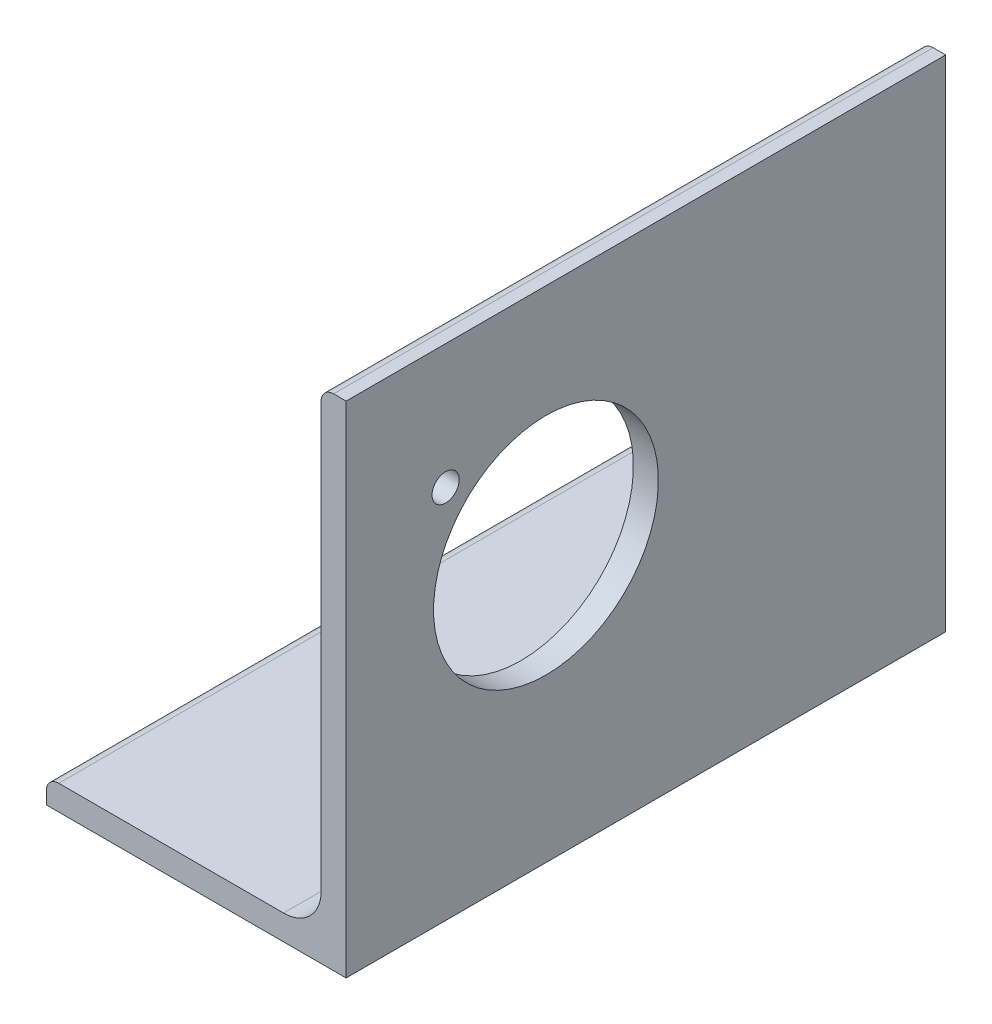
ISO-10303-21;
HEADER;
FILE_DESCRIPTION(('STEP AP214'),'2;1');
FILE_NAME('part.step','',(''),(''),'','','');
FILE_SCHEMA(('AUTOMOTIVE_DESIGN { 1 0 10303 214 1 1 1 1 }'));
ENDSEC;
DATA;
#1=APPLICATION_CONTEXT('core data for automotive mechanical design processes');
#2=APPLICATION_PROTOCOL_DEFINITION('international standard','automotive_design',2000,#1);
#3=PRODUCT_CONTEXT('',#1,'mechanical');
#4=PRODUCT('Part','Part','',(#3));
#5=PRODUCT_RELATED_PRODUCT_CATEGORY('part','',(#4));
#6=PRODUCT_DEFINITION_FORMATION('','',#4);
#7=PRODUCT_DEFINITION_CONTEXT('part definition',#1,'design');
#8=PRODUCT_DEFINITION('design','',#6,#7);
#9=PRODUCT_DEFINITION_SHAPE('','',#8);
#10=(LENGTH_UNIT() NAMED_UNIT(*) SI_UNIT(.MILLI.,.METRE.));
#11=(NAMED_UNIT(*) PLANE_ANGLE_UNIT() SI_UNIT($,.RADIAN.));
#12=(NAMED_UNIT(*) SI_UNIT($,.STERADIAN.) SOLID_ANGLE_UNIT());
#13=UNCERTAINTY_MEASURE_WITH_UNIT(LENGTH_MEASURE(1.E-05),#10,'distance_accuracy_value','');
#14=(GEOMETRIC_REPRESENTATION_CONTEXT(3) GLOBAL_UNCERTAINTY_ASSIGNED_CONTEXT((#13)) GLOBAL_UNIT_ASSIGNED_CONTEXT((#10,
#11,#12)) REPRESENTATION_CONTEXT('',''));
#15=CARTESIAN_POINT('',(0.,0.,0.));
#16=DIRECTION('',(0.,0.,1.));
#17=DIRECTION('',(1.,0.,0.));
#18=AXIS2_PLACEMENT_3D('',#15,#16,#17);
#19=CARTESIAN_POINT('',(-19.05,-30.1625,38.1));
#20=DIRECTION('',(1.,0.,0.));
#21=DIRECTION('',(0.,0.,-1.));
#22=AXIS2_PLACEMENT_3D('',#19,#20,#21);
#23=PLANE('',#22);
#24=DIRECTION('',(0.,-1.,0.));
#25=VECTOR('',#24,1.);
#26=CARTESIAN_POINT('',(-19.05,-30.1625,-38.1));
#27=LINE('',#26,#25);
#28=CARTESIAN_POINT('',(-19.05,-30.1625,-38.1));
#29=VERTEX_POINT('',#28);
#30=CARTESIAN_POINT('',(-19.05,-31.75,-38.1));
#31=VERTEX_POINT('',#30);
#32=EDGE_CURVE('E153',#29,#31,#27,.T.);
#33=ORIENTED_EDGE('',*,*,#32,.T.);
#34=DIRECTION('',(0.,0.,-1.));
#35=VECTOR('',#34,1.);
#36=CARTESIAN_POINT('',(-19.05,-31.75,38.1));
#37=LINE('',#36,#35);
#38=CARTESIAN_POINT('',(-19.05,-31.75,38.1));
#39=VERTEX_POINT('',#38);
#40=EDGE_CURVE('E11',#39,#31,#37,.T.);
#41=ORIENTED_EDGE('',*,*,#40,.F.);
#42=DIRECTION('',(0.,-1.,0.));
#43=VECTOR('',#42,1.);
#44=CARTESIAN_POINT('',(-19.05,-30.1625,38.1));
#45=LINE('',#44,#43);
#46=CARTESIAN_POINT('',(-19.05,-30.1625,38.1));
#47=VERTEX_POINT('',#46);
#48=EDGE_CURVE('E179',#47,#39,#45,.T.);
#49=ORIENTED_EDGE('',*,*,#48,.F.);
#50=DIRECTION('',(0.,0.,-1.));
#51=VECTOR('',#50,1.);
#52=CARTESIAN_POINT('',(-19.05,-30.1625,38.1));
#53=LINE('',#52,#51);
#54=EDGE_CURVE('E149',#47,#29,#53,.T.);
#55=ORIENTED_EDGE('',*,*,#54,.T.);
#56=EDGE_LOOP('',(#33,#41,#49,#55));
#57=FACE_BOUND('',#56,.T.);
#58=ADVANCED_FACE('F44',(#57),#23,.F.);
#59=CARTESIAN_POINT('',(-19.05,-31.75,38.1));
#60=DIRECTION('',(0.,1.,0.));
#61=DIRECTION('',(-1.,0.,0.));
#62=AXIS2_PLACEMENT_3D('',#59,#60,#61);
#63=PLANE('',#62);
#64=CARTESIAN_POINT('',(0.,-31.75,0.));
#65=DIRECTION('',(0.,-1.,0.));
#66=DIRECTION('',(1.,0.,0.));
#67=AXIS2_PLACEMENT_3D('',#64,#65,#66);
#68=CIRCLE('',#67,2.4892);
#69=CARTESIAN_POINT('',(2.4892,-31.75,0.));
#70=VERTEX_POINT('',#69);
#71=EDGE_CURVE('E203',#70,#70,#68,.T.);
#72=ORIENTED_EDGE('',*,*,#71,.F.);
#73=EDGE_LOOP('',(#72));
#74=FACE_BOUND('',#73,.T.);
#75=CARTESIAN_POINT('',(0.,-31.75,-25.4));
#76=DIRECTION('',(0.,-1.,0.));
#77=DIRECTION('',(1.,0.,0.));
#78=AXIS2_PLACEMENT_3D('',#75,#76,#77);
#79=CIRCLE('',#78,2.4892);
#80=CARTESIAN_POINT('',(2.4892,-31.75,-25.4));
#81=VERTEX_POINT('',#80);
#82=EDGE_CURVE('E211',#81,#81,#79,.T.);
#83=ORIENTED_EDGE('',*,*,#82,.F.);
#84=EDGE_LOOP('',(#83));
#85=FACE_BOUND('',#84,.T.);
#86=DIRECTION('',(1.,0.,0.));
#87=VECTOR('',#86,1.);
#88=CARTESIAN_POINT('',(-19.05,-31.75,-38.1));
#89=LINE('',#88,#87);
#90=CARTESIAN_POINT('',(19.05,-31.75,-38.1));
#91=VERTEX_POINT('',#90);
#92=EDGE_CURVE('E157',#31,#91,#89,.T.);
#93=ORIENTED_EDGE('',*,*,#92,.T.);
#94=DIRECTION('',(0.,0.,-1.));
#95=VECTOR('',#94,1.);
#96=CARTESIAN_POINT('',(19.05,-31.75,38.1));
#97=LINE('',#96,#95);
#98=CARTESIAN_POINT('',(19.05,-31.75,38.1));
#99=VERTEX_POINT('',#98);
#100=EDGE_CURVE('E54',#99,#91,#97,.T.);
#101=ORIENTED_EDGE('',*,*,#100,.F.);
#102=DIRECTION('',(1.,0.,0.));
#103=VECTOR('',#102,1.);
#104=CARTESIAN_POINT('',(-19.05,-31.75,38.1));
#105=LINE('',#104,#103);
#106=EDGE_CURVE('E109',#39,#99,#105,.T.);
#107=ORIENTED_EDGE('',*,*,#106,.F.);
#108=ORIENTED_EDGE('',*,*,#40,.T.);
#109=EDGE_LOOP('',(#93,#101,#107,#108));
#110=FACE_BOUND('',#109,.T.);
#111=ADVANCED_FACE('F275',(#74,#85,#110),#63,.F.);
#112=CARTESIAN_POINT('',(19.05,-31.75,38.1));
#113=DIRECTION('',(-1.,0.,0.));
#114=DIRECTION('',(0.,-1.,0.));
#115=AXIS2_PLACEMENT_3D('',#112,#113,#114);
#116=PLANE('',#115);
#117=CARTESIAN_POINT('',(19.05,15.9317261919403,25.4519637415276));
#118=DIRECTION('',(-1.,0.,0.));
#119=DIRECTION('',(0.,-1.,0.));
#120=AXIS2_PLACEMENT_3D('',#117,#118,#119);
#121=CIRCLE('',#120,1.7272);
#122=CARTESIAN_POINT('',(19.05,14.2045261919403,25.4519637415276));
#123=VERTEX_POINT('',#122);
#124=EDGE_CURVE('E209',#123,#123,#121,.T.);
#125=ORIENTED_EDGE('',*,*,#124,.T.);
#126=EDGE_LOOP('',(#125));
#127=FACE_BOUND('',#126,.T.);
#128=CARTESIAN_POINT('',(19.05,3.17976250002207,12.7000000496094));
#129=DIRECTION('',(-1.,0.,0.));
#130=DIRECTION('',(0.,-1.,0.));
#131=AXIS2_PLACEMENT_3D('',#128,#129,#130);
#132=CIRCLE('',#131,14.2875);
#133=CARTESIAN_POINT('',(19.05,-11.1077374999779,12.7000000496094));
#134=VERTEX_POINT('',#133);
#135=EDGE_CURVE('E158',#134,#134,#132,.T.);
#136=ORIENTED_EDGE('',*,*,#135,.T.);
#137=EDGE_LOOP('',(#136));
#138=FACE_BOUND('',#137,.T.);
#139=DIRECTION('',(0.,1.,0.));
#140=VECTOR('',#139,1.);
#141=CARTESIAN_POINT('',(19.05,-31.75,-38.1));
#142=LINE('',#141,#140);
#143=CARTESIAN_POINT('',(19.05,31.75,-38.1));
#144=VERTEX_POINT('',#143);
#145=EDGE_CURVE('E161',#91,#144,#142,.T.);
#146=ORIENTED_EDGE('',*,*,#145,.T.);
#147=DIRECTION('',(0.,0.,-1.));
#148=VECTOR('',#147,1.);
#149=CARTESIAN_POINT('',(19.05,31.75,38.1));
#150=LINE('',#149,#148);
#151=CARTESIAN_POINT('',(19.05,31.75,38.1));
#152=VERTEX_POINT('',#151);
#153=EDGE_CURVE('E194',#152,#144,#150,.T.);
#154=ORIENTED_EDGE('',*,*,#153,.F.);
#155=DIRECTION('',(0.,1.,0.));
#156=VECTOR('',#155,1.);
#157=CARTESIAN_POINT('',(19.05,-31.75,38.1));
#158=LINE('',#157,#156);
#159=EDGE_CURVE('E237',#99,#152,#158,.T.);
#160=ORIENTED_EDGE('',*,*,#159,.F.);
#161=ORIENTED_EDGE('',*,*,#100,.T.);
#162=EDGE_LOOP('',(#146,#154,#160,#161));
#163=FACE_BOUND('',#162,.T.);
#164=ADVANCED_FACE('F279',(#127,#138,#163),#116,.F.);
#165=CARTESIAN_POINT('',(17.4625,31.75,38.1));
#166=DIRECTION('',(0.,-1.,0.));
#167=DIRECTION('',(1.,0.,0.));
#168=AXIS2_PLACEMENT_3D('',#165,#166,#167);
#169=PLANE('',#168);
#170=DIRECTION('',(-1.,0.,0.));
#171=VECTOR('',#170,1.);
#172=CARTESIAN_POINT('',(17.4625,31.75,-38.1));
#173=LINE('',#172,#171);
#174=CARTESIAN_POINT('',(17.4625,31.75,-38.1));
#175=VERTEX_POINT('',#174);
#176=EDGE_CURVE('E164',#144,#175,#173,.T.);
#177=ORIENTED_EDGE('',*,*,#176,.T.);
#178=DIRECTION('',(0.,0.,-1.));
#179=VECTOR('',#178,1.);
#180=CARTESIAN_POINT('',(17.4625,31.75,38.1));
#181=LINE('',#180,#179);
#182=CARTESIAN_POINT('',(17.4625,31.75,38.1));
#183=VERTEX_POINT('',#182);
#184=EDGE_CURVE('E190',#183,#175,#181,.T.);
#185=ORIENTED_EDGE('',*,*,#184,.F.);
#186=DIRECTION('',(-1.,0.,0.));
#187=VECTOR('',#186,1.);
#188=CARTESIAN_POINT('',(17.4625,31.75,38.1));
#189=LINE('',#188,#187);
#190=EDGE_CURVE('E240',#152,#183,#189,.T.);
#191=ORIENTED_EDGE('',*,*,#190,.F.);
#192=ORIENTED_EDGE('',*,*,#153,.T.);
#193=EDGE_LOOP('',(#177,#185,#191,#192));
#194=FACE_BOUND('',#193,.T.);
#195=ADVANCED_FACE('F284',(#194),#169,.F.);
#196=CARTESIAN_POINT('',(17.4625,30.1625,38.1));
#197=DIRECTION('',(0.,0.,-1.));
#198=DIRECTION('',(-1.,0.,0.));
#199=AXIS2_PLACEMENT_3D('',#196,#197,#198);
#200=CYLINDRICAL_SURFACE('',#199,1.5875);
#201=CARTESIAN_POINT('',(17.4625,30.1625,-38.1));
#202=DIRECTION('',(0.,0.,1.));
#203=DIRECTION('',(-1.,0.,0.));
#204=AXIS2_PLACEMENT_3D('',#201,#202,#203);
#205=CIRCLE('',#204,1.5875);
#206=CARTESIAN_POINT('',(15.875,30.1625,-38.1));
#207=VERTEX_POINT('',#206);
#208=EDGE_CURVE('E167',#175,#207,#205,.T.);
#209=ORIENTED_EDGE('',*,*,#208,.T.);
#210=DIRECTION('',(0.,0.,-1.));
#211=VECTOR('',#210,1.);
#212=CARTESIAN_POINT('',(15.875,30.1625,38.1));
#213=LINE('',#212,#211);
#214=CARTESIAN_POINT('',(15.875,30.1625,38.1));
#215=VERTEX_POINT('',#214);
#216=EDGE_CURVE('E186',#215,#207,#213,.T.);
#217=ORIENTED_EDGE('',*,*,#216,.F.);
#218=CARTESIAN_POINT('',(17.4625,30.1625,38.1));
#219=DIRECTION('',(0.,0.,1.));
#220=DIRECTION('',(-1.,0.,0.));
#221=AXIS2_PLACEMENT_3D('',#218,#219,#220);
#222=CIRCLE('',#221,1.5875);
#223=EDGE_CURVE('E243',#183,#215,#222,.T.);
#224=ORIENTED_EDGE('',*,*,#223,.F.);
#225=ORIENTED_EDGE('',*,*,#184,.T.);
#226=EDGE_LOOP('',(#209,#217,#224,#225));
#227=FACE_BOUND('',#226,.T.);
#228=ADVANCED_FACE('F251',(#227),#200,.T.);
#229=CARTESIAN_POINT('',(15.875,30.1625,38.1));
#230=DIRECTION('',(1.,0.,0.));
#231=DIRECTION('',(0.,1.,0.));
#232=AXIS2_PLACEMENT_3D('',#229,#230,#231);
#233=PLANE('',#232);
#234=CARTESIAN_POINT('',(15.875,15.9317261919403,25.4519637415276));
#235=DIRECTION('',(-1.,0.,0.));
#236=DIRECTION('',(0.,-1.,0.));
#237=AXIS2_PLACEMENT_3D('',#234,#235,#236);
#238=CIRCLE('',#237,1.7272);
#239=CARTESIAN_POINT('',(15.875,14.2045261919403,25.4519637415276));
#240=VERTEX_POINT('',#239);
#241=EDGE_CURVE('E219',#240,#240,#238,.T.);
#242=ORIENTED_EDGE('',*,*,#241,.F.);
#243=EDGE_LOOP('',(#242));
#244=FACE_BOUND('',#243,.T.);
#245=CARTESIAN_POINT('',(15.875,3.17976250002207,12.7000000496094));
#246=DIRECTION('',(-1.,0.,0.));
#247=DIRECTION('',(0.,-1.,0.));
#248=AXIS2_PLACEMENT_3D('',#245,#246,#247);
#249=CIRCLE('',#248,14.2875);
#250=CARTESIAN_POINT('',(15.875,-11.1077374999779,12.7000000496094));
#251=VERTEX_POINT('',#250);
#252=EDGE_CURVE('E223',#251,#251,#249,.T.);
#253=ORIENTED_EDGE('',*,*,#252,.F.);
#254=EDGE_LOOP('',(#253));
#255=FACE_BOUND('',#254,.T.);
#256=DIRECTION('',(0.,-1.,0.));
#257=VECTOR('',#256,1.);
#258=CARTESIAN_POINT('',(15.875,30.1625,-38.1));
#259=LINE('',#258,#257);
#260=CARTESIAN_POINT('',(15.875,-23.7998,-38.1));
#261=VERTEX_POINT('',#260);
#262=EDGE_CURVE('E170',#207,#261,#259,.T.);
#263=ORIENTED_EDGE('',*,*,#262,.T.);
#264=DIRECTION('',(0.,0.,-1.));
#265=VECTOR('',#264,1.);
#266=CARTESIAN_POINT('',(15.875,-23.7998,38.1));
#267=LINE('',#266,#265);
#268=CARTESIAN_POINT('',(15.875,-23.7998,38.1));
#269=VERTEX_POINT('',#268);
#270=EDGE_CURVE('E142',#269,#261,#267,.T.);
#271=ORIENTED_EDGE('',*,*,#270,.F.);
#272=DIRECTION('',(0.,-1.,0.));
#273=VECTOR('',#272,1.);
#274=CARTESIAN_POINT('',(15.875,30.1625,38.1));
#275=LINE('',#274,#273);
#276=EDGE_CURVE('E131',#215,#269,#275,.T.);
#277=ORIENTED_EDGE('',*,*,#276,.F.);
#278=ORIENTED_EDGE('',*,*,#216,.T.);
#279=EDGE_LOOP('',(#263,#271,#277,#278));
#280=FACE_BOUND('',#279,.T.);
#281=ADVANCED_FACE('F255',(#244,#255,#280),#233,.F.);
#282=CARTESIAN_POINT('',(11.0998,-23.7998,38.1));
#283=DIRECTION('',(0.,0.,-1.));
#284=DIRECTION('',(-1.,0.,0.));
#285=AXIS2_PLACEMENT_3D('',#282,#283,#284);
#286=CYLINDRICAL_SURFACE('',#285,4.7752);
#287=CARTESIAN_POINT('',(11.0998,-23.7998,-38.1));
#288=DIRECTION('',(0.,0.,-1.));
#289=DIRECTION('',(-1.,0.,0.));
#290=AXIS2_PLACEMENT_3D('',#287,#288,#289);
#291=CIRCLE('',#290,4.7752);
#292=CARTESIAN_POINT('',(11.0998,-28.575,-38.1));
#293=VERTEX_POINT('',#292);
#294=EDGE_CURVE('E140',#261,#293,#291,.T.);
#295=ORIENTED_EDGE('',*,*,#294,.T.);
#296=DIRECTION('',(0.,0.,-1.));
#297=VECTOR('',#296,1.);
#298=CARTESIAN_POINT('',(11.0998,-28.575,38.1));
#299=LINE('',#298,#297);
#300=CARTESIAN_POINT('',(11.0998,-28.575,38.1));
#301=VERTEX_POINT('',#300);
#302=EDGE_CURVE('E137',#301,#293,#299,.T.);
#303=ORIENTED_EDGE('',*,*,#302,.F.);
#304=CARTESIAN_POINT('',(11.0998,-23.7998,38.1));
#305=DIRECTION('',(0.,0.,-1.));
#306=DIRECTION('',(-1.,0.,0.));
#307=AXIS2_PLACEMENT_3D('',#304,#305,#306);
#308=CIRCLE('',#307,4.7752);
#309=EDGE_CURVE('E125',#269,#301,#308,.T.);
#310=ORIENTED_EDGE('',*,*,#309,.F.);
#311=ORIENTED_EDGE('',*,*,#270,.T.);
#312=EDGE_LOOP('',(#295,#303,#310,#311));
#313=FACE_BOUND('',#312,.T.);
#314=ADVANCED_FACE('F138',(#313),#286,.F.);
#315=CARTESIAN_POINT('',(11.0998,-28.575,38.1));
#316=DIRECTION('',(0.,-1.,0.));
#317=DIRECTION('',(1.,0.,0.));
#318=AXIS2_PLACEMENT_3D('',#315,#316,#317);
#319=PLANE('',#318);
#320=CARTESIAN_POINT('',(0.,-28.575,0.));
#321=DIRECTION('',(0.,-1.,0.));
#322=DIRECTION('',(1.,0.,0.));
#323=AXIS2_PLACEMENT_3D('',#320,#321,#322);
#324=CIRCLE('',#323,2.4892);
#325=CARTESIAN_POINT('',(2.4892,-28.575,0.));
#326=VERTEX_POINT('',#325);
#327=EDGE_CURVE('E47',#326,#326,#324,.T.);
#328=ORIENTED_EDGE('',*,*,#327,.T.);
#329=EDGE_LOOP('',(#328));
#330=FACE_BOUND('',#329,.T.);
#331=CARTESIAN_POINT('',(0.,-28.575,-25.4));
#332=DIRECTION('',(0.,-1.,0.));
#333=DIRECTION('',(1.,0.,0.));
#334=AXIS2_PLACEMENT_3D('',#331,#332,#333);
#335=CIRCLE('',#334,2.4892);
#336=CARTESIAN_POINT('',(2.4892,-28.575,-25.4));
#337=VERTEX_POINT('',#336);
#338=EDGE_CURVE('E200',#337,#337,#335,.T.);
#339=ORIENTED_EDGE('',*,*,#338,.T.);
#340=EDGE_LOOP('',(#339));
#341=FACE_BOUND('',#340,.T.);
#342=DIRECTION('',(-1.,0.,0.));
#343=VECTOR('',#342,1.);
#344=CARTESIAN_POINT('',(11.0998,-28.575,-38.1));
#345=LINE('',#344,#343);
#346=CARTESIAN_POINT('',(-17.4625,-28.575,-38.1));
#347=VERTEX_POINT('',#346);
#348=EDGE_CURVE('E95',#293,#347,#345,.T.);
#349=ORIENTED_EDGE('',*,*,#348,.T.);
#350=DIRECTION('',(0.,0.,-1.));
#351=VECTOR('',#350,1.);
#352=CARTESIAN_POINT('',(-17.4625,-28.575,38.1));
#353=LINE('',#352,#351);
#354=CARTESIAN_POINT('',(-17.4625,-28.575,38.1));
#355=VERTEX_POINT('',#354);
#356=EDGE_CURVE('E143',#355,#347,#353,.T.);
#357=ORIENTED_EDGE('',*,*,#356,.F.);
#358=DIRECTION('',(-1.,0.,0.));
#359=VECTOR('',#358,1.);
#360=CARTESIAN_POINT('',(11.0998,-28.575,38.1));
#361=LINE('',#360,#359);
#362=EDGE_CURVE('E129',#301,#355,#361,.T.);
#363=ORIENTED_EDGE('',*,*,#362,.F.);
#364=ORIENTED_EDGE('',*,*,#302,.T.);
#365=EDGE_LOOP('',(#349,#357,#363,#364));
#366=FACE_BOUND('',#365,.T.);
#367=ADVANCED_FACE('F145',(#330,#341,#366),#319,.F.);
#368=CARTESIAN_POINT('',(-17.4625,-30.1625,38.1));
#369=DIRECTION('',(0.,0.,-1.));
#370=DIRECTION('',(-1.,0.,0.));
#371=AXIS2_PLACEMENT_3D('',#368,#369,#370);
#372=CYLINDRICAL_SURFACE('',#371,1.5875);
#373=CARTESIAN_POINT('',(-17.4625,-30.1625,-38.1));
#374=DIRECTION('',(0.,0.,1.));
#375=DIRECTION('',(-1.,0.,0.));
#376=AXIS2_PLACEMENT_3D('',#373,#374,#375);
#377=CIRCLE('',#376,1.5875);
#378=EDGE_CURVE('E101',#347,#29,#377,.T.);
#379=ORIENTED_EDGE('',*,*,#378,.T.);
#380=ORIENTED_EDGE('',*,*,#54,.F.);
#381=CARTESIAN_POINT('',(-17.4625,-30.1625,38.1));
#382=DIRECTION('',(0.,0.,1.));
#383=DIRECTION('',(-1.,0.,0.));
#384=AXIS2_PLACEMENT_3D('',#381,#382,#383);
#385=CIRCLE('',#384,1.5875);
#386=EDGE_CURVE('E63',#355,#47,#385,.T.);
#387=ORIENTED_EDGE('',*,*,#386,.F.);
#388=ORIENTED_EDGE('',*,*,#356,.T.);
#389=EDGE_LOOP('',(#379,#380,#387,#388));
#390=FACE_BOUND('',#389,.T.);
#391=ADVANCED_FACE('F263',(#390),#372,.T.);
#392=CARTESIAN_POINT('',(17.4625,30.1625,38.1));
#393=DIRECTION('',(0.,0.,-1.));
#394=DIRECTION('',(-1.,0.,0.));
#395=AXIS2_PLACEMENT_3D('',#392,#393,#394);
#396=PLANE('',#395);
#397=ORIENTED_EDGE('',*,*,#48,.T.);
#398=ORIENTED_EDGE('',*,*,#106,.T.);
#399=ORIENTED_EDGE('',*,*,#159,.T.);
#400=ORIENTED_EDGE('',*,*,#190,.T.);
#401=ORIENTED_EDGE('',*,*,#223,.T.);
#402=ORIENTED_EDGE('',*,*,#276,.T.);
#403=ORIENTED_EDGE('',*,*,#309,.T.);
#404=ORIENTED_EDGE('',*,*,#362,.T.);
#405=ORIENTED_EDGE('',*,*,#386,.T.);
#406=EDGE_LOOP('',(#397,#398,#399,#400,#401,#402,#403,#404,#405));
#407=FACE_BOUND('',#406,.T.);
#408=ADVANCED_FACE('F127',(#407),#396,.F.);
#409=CARTESIAN_POINT('',(17.4625,30.1625,-38.1));
#410=DIRECTION('',(0.,0.,-1.));
#411=DIRECTION('',(-1.,0.,0.));
#412=AXIS2_PLACEMENT_3D('',#409,#410,#411);
#413=PLANE('',#412);
#414=ORIENTED_EDGE('',*,*,#32,.F.);
#415=ORIENTED_EDGE('',*,*,#378,.F.);
#416=ORIENTED_EDGE('',*,*,#348,.F.);
#417=ORIENTED_EDGE('',*,*,#294,.F.);
#418=ORIENTED_EDGE('',*,*,#262,.F.);
#419=ORIENTED_EDGE('',*,*,#208,.F.);
#420=ORIENTED_EDGE('',*,*,#176,.F.);
#421=ORIENTED_EDGE('',*,*,#145,.F.);
#422=ORIENTED_EDGE('',*,*,#92,.F.);
#423=EDGE_LOOP('',(#414,#415,#416,#417,#418,#419,#420,#421,#422));
#424=FACE_BOUND('',#423,.T.);
#425=ADVANCED_FACE('F258',(#424),#413,.T.);
#426=CARTESIAN_POINT('',(19.05,3.17976250002207,12.7000000496094));
#427=DIRECTION('',(-1.,0.,0.));
#428=DIRECTION('',(0.,-1.,0.));
#429=AXIS2_PLACEMENT_3D('',#426,#427,#428);
#430=CYLINDRICAL_SURFACE('',#429,14.2875);
#431=ORIENTED_EDGE('',*,*,#135,.F.);
#432=EDGE_LOOP('',(#431));
#433=FACE_BOUND('',#432,.T.);
#434=ORIENTED_EDGE('',*,*,#252,.T.);
#435=EDGE_LOOP('',(#434));
#436=FACE_BOUND('',#435,.T.);
#437=ADVANCED_FACE('F345',(#433,#436),#430,.F.);
#438=CARTESIAN_POINT('',(19.05,15.9317261919403,25.4519637415276));
#439=DIRECTION('',(-1.,0.,0.));
#440=DIRECTION('',(0.,-1.,0.));
#441=AXIS2_PLACEMENT_3D('',#438,#439,#440);
#442=CYLINDRICAL_SURFACE('',#441,1.7272);
#443=ORIENTED_EDGE('',*,*,#124,.F.);
#444=EDGE_LOOP('',(#443));
#445=FACE_BOUND('',#444,.T.);
#446=ORIENTED_EDGE('',*,*,#241,.T.);
#447=EDGE_LOOP('',(#446));
#448=FACE_BOUND('',#447,.T.);
#449=ADVANCED_FACE('F323',(#445,#448),#442,.F.);
#450=CARTESIAN_POINT('',(0.,31.75,-25.4));
#451=DIRECTION('',(0.,-1.,0.));
#452=DIRECTION('',(1.,0.,0.));
#453=AXIS2_PLACEMENT_3D('',#450,#451,#452);
#454=CYLINDRICAL_SURFACE('',#453,2.4892);
#455=ORIENTED_EDGE('',*,*,#82,.T.);
#456=EDGE_LOOP('',(#455));
#457=FACE_BOUND('',#456,.T.);
#458=ORIENTED_EDGE('',*,*,#338,.F.);
#459=EDGE_LOOP('',(#458));
#460=FACE_BOUND('',#459,.T.);
#461=ADVANCED_FACE('F317',(#457,#460),#454,.F.);
#462=CARTESIAN_POINT('',(0.,31.75,0.));
#463=DIRECTION('',(0.,-1.,0.));
#464=DIRECTION('',(1.,0.,0.));
#465=AXIS2_PLACEMENT_3D('',#462,#463,#464);
#466=CYLINDRICAL_SURFACE('',#465,2.4892);
#467=ORIENTED_EDGE('',*,*,#71,.T.);
#468=EDGE_LOOP('',(#467));
#469=FACE_BOUND('',#468,.T.);
#470=ORIENTED_EDGE('',*,*,#327,.F.);
#471=EDGE_LOOP('',(#470));
#472=FACE_BOUND('',#471,.T.);
#473=ADVANCED_FACE('F322',(#469,#472),#466,.F.);
#474=CLOSED_SHELL('',(#58,#111,#164,#195,#228,#281,#314,#367,#391,#408,#425,#437,#449,#461,#473));
#475=MANIFOLD_SOLID_BREP('B2',#474);
#476=ADVANCED_BREP_SHAPE_REPRESENTATION('',(#18,#475),#14);
#477=SHAPE_DEFINITION_REPRESENTATION(#9,#476);
ENDSEC;
END-ISO-10303-21;
